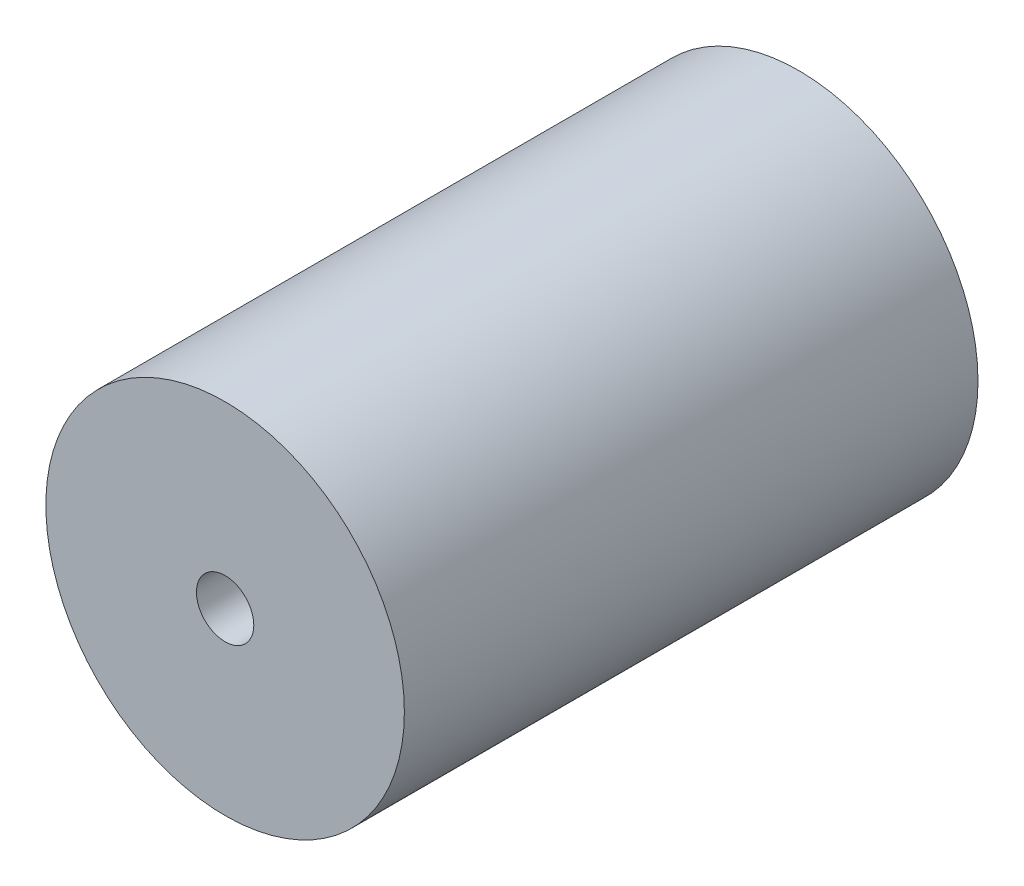
ISO-10303-21;
HEADER;
FILE_DESCRIPTION(('STEP AP214'),'2;1');
FILE_NAME('part.step','',(''),(''),'','','');
FILE_SCHEMA(('AUTOMOTIVE_DESIGN { 1 0 10303 214 1 1 1 1 }'));
ENDSEC;
DATA;
#1=APPLICATION_CONTEXT('core data for automotive mechanical design processes');
#2=APPLICATION_PROTOCOL_DEFINITION('international standard','automotive_design',2000,#1);
#3=PRODUCT_CONTEXT('',#1,'mechanical');
#4=PRODUCT('Part','Part','',(#3));
#5=PRODUCT_RELATED_PRODUCT_CATEGORY('part','',(#4));
#6=PRODUCT_DEFINITION_FORMATION('','',#4);
#7=PRODUCT_DEFINITION_CONTEXT('part definition',#1,'design');
#8=PRODUCT_DEFINITION('design','',#6,#7);
#9=PRODUCT_DEFINITION_SHAPE('','',#8);
#10=(LENGTH_UNIT() NAMED_UNIT(*) SI_UNIT(.MILLI.,.METRE.));
#11=(NAMED_UNIT(*) PLANE_ANGLE_UNIT() SI_UNIT($,.RADIAN.));
#12=(NAMED_UNIT(*) SI_UNIT($,.STERADIAN.) SOLID_ANGLE_UNIT());
#13=UNCERTAINTY_MEASURE_WITH_UNIT(LENGTH_MEASURE(1.E-05),#10,'distance_accuracy_value','');
#14=(GEOMETRIC_REPRESENTATION_CONTEXT(3) GLOBAL_UNCERTAINTY_ASSIGNED_CONTEXT((#13)) GLOBAL_UNIT_ASSIGNED_CONTEXT((#10,
#11,#12)) REPRESENTATION_CONTEXT('',''));
#15=CARTESIAN_POINT('',(0.,0.,0.));
#16=DIRECTION('',(0.,0.,1.));
#17=DIRECTION('',(1.,0.,0.));
#18=AXIS2_PLACEMENT_3D('',#15,#16,#17);
#19=CARTESIAN_POINT('',(0.,0.,40.));
#20=DIRECTION('',(0.,0.,1.));
#21=DIRECTION('',(1.,0.,0.));
#22=AXIS2_PLACEMENT_3D('',#19,#20,#21);
#23=PLANE('',#22);
#24=CARTESIAN_POINT('',(0.,0.,40.));
#25=DIRECTION('',(0.,0.,1.));
#26=DIRECTION('',(1.,0.,0.));
#27=AXIS2_PLACEMENT_3D('',#24,#25,#26);
#28=CIRCLE('',#27,12.5);
#29=CARTESIAN_POINT('',(12.5,0.,40.));
#30=VERTEX_POINT('',#29);
#31=EDGE_CURVE('E10',#30,#30,#28,.T.);
#32=ORIENTED_EDGE('',*,*,#31,.T.);
#33=EDGE_LOOP('',(#32));
#34=FACE_BOUND('',#33,.T.);
#35=CARTESIAN_POINT('',(0.,0.,40.));
#36=DIRECTION('',(0.,0.,1.));
#37=DIRECTION('',(1.,0.,0.));
#38=AXIS2_PLACEMENT_3D('',#35,#36,#37);
#39=CIRCLE('',#38,2.);
#40=CARTESIAN_POINT('',(2.,0.,40.));
#41=VERTEX_POINT('',#40);
#42=EDGE_CURVE('E49',#41,#41,#39,.T.);
#43=ORIENTED_EDGE('',*,*,#42,.F.);
#44=EDGE_LOOP('',(#43));
#45=FACE_BOUND('',#44,.T.);
#46=ADVANCED_FACE('F39',(#34,#45),#23,.T.);
#47=CARTESIAN_POINT('',(0.,0.,0.));
#48=DIRECTION('',(0.,0.,1.));
#49=DIRECTION('',(1.,0.,0.));
#50=AXIS2_PLACEMENT_3D('',#47,#48,#49);
#51=PLANE('',#50);
#52=CARTESIAN_POINT('',(0.,0.,0.));
#53=DIRECTION('',(0.,0.,1.));
#54=DIRECTION('',(1.,0.,0.));
#55=AXIS2_PLACEMENT_3D('',#52,#53,#54);
#56=CIRCLE('',#55,12.5);
#57=CARTESIAN_POINT('',(12.5,0.,0.));
#58=VERTEX_POINT('',#57);
#59=EDGE_CURVE('E43',#58,#58,#56,.T.);
#60=ORIENTED_EDGE('',*,*,#59,.F.);
#61=EDGE_LOOP('',(#60));
#62=FACE_BOUND('',#61,.T.);
#63=CARTESIAN_POINT('',(0.,0.,0.));
#64=DIRECTION('',(0.,0.,1.));
#65=DIRECTION('',(1.,0.,0.));
#66=AXIS2_PLACEMENT_3D('',#63,#64,#65);
#67=CIRCLE('',#66,2.);
#68=CARTESIAN_POINT('',(2.,0.,0.));
#69=VERTEX_POINT('',#68);
#70=EDGE_CURVE('E55',#69,#69,#67,.T.);
#71=ORIENTED_EDGE('',*,*,#70,.T.);
#72=EDGE_LOOP('',(#71));
#73=FACE_BOUND('',#72,.T.);
#74=ADVANCED_FACE('F64',(#62,#73),#51,.F.);
#75=CARTESIAN_POINT('',(0.,0.,40.));
#76=DIRECTION('',(0.,0.,-1.));
#77=DIRECTION('',(-1.,0.,0.));
#78=AXIS2_PLACEMENT_3D('',#75,#76,#77);
#79=CYLINDRICAL_SURFACE('',#78,12.5);
#80=ORIENTED_EDGE('',*,*,#31,.F.);
#81=EDGE_LOOP('',(#80));
#82=FACE_BOUND('',#81,.T.);
#83=ORIENTED_EDGE('',*,*,#59,.T.);
#84=EDGE_LOOP('',(#83));
#85=FACE_BOUND('',#84,.T.);
#86=ADVANCED_FACE('F41',(#82,#85),#79,.T.);
#87=CARTESIAN_POINT('',(0.,0.,40.));
#88=DIRECTION('',(0.,0.,-1.));
#89=DIRECTION('',(-1.,0.,0.));
#90=AXIS2_PLACEMENT_3D('',#87,#88,#89);
#91=CYLINDRICAL_SURFACE('',#90,2.);
#92=ORIENTED_EDGE('',*,*,#42,.T.);
#93=EDGE_LOOP('',(#92));
#94=FACE_BOUND('',#93,.T.);
#95=ORIENTED_EDGE('',*,*,#70,.F.);
#96=EDGE_LOOP('',(#95));
#97=FACE_BOUND('',#96,.T.);
#98=ADVANCED_FACE('F59',(#94,#97),#91,.F.);
#99=CLOSED_SHELL('',(#46,#74,#86,#98));
#100=MANIFOLD_SOLID_BREP('B2',#99);
#101=ADVANCED_BREP_SHAPE_REPRESENTATION('',(#18,#100),#14);
#102=SHAPE_DEFINITION_REPRESENTATION(#9,#101);
ENDSEC;
END-ISO-10303-21;
